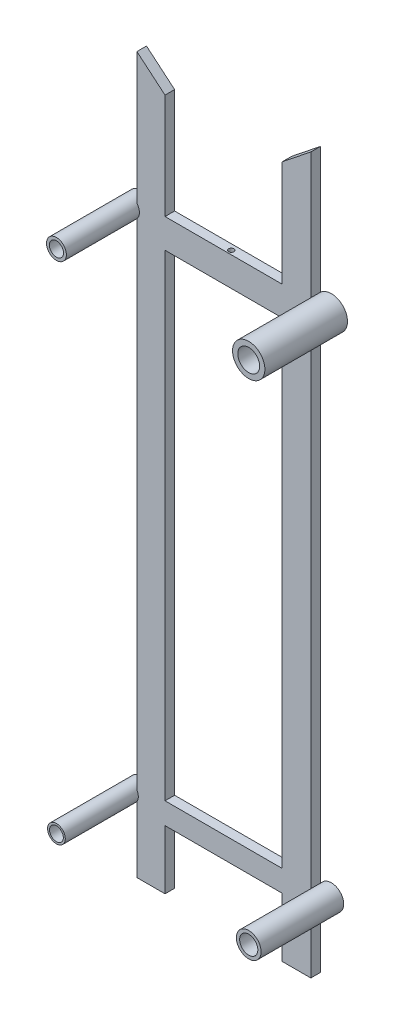
ISO-10303-21;
HEADER;
FILE_DESCRIPTION(('STEP AP214'),'2;1');
FILE_NAME('part.step','',(''),(''),'','','');
FILE_SCHEMA(('AUTOMOTIVE_DESIGN { 1 0 10303 214 1 1 1 1 }'));
ENDSEC;
DATA;
#1=APPLICATION_CONTEXT('core data for automotive mechanical design processes');
#2=APPLICATION_PROTOCOL_DEFINITION('international standard','automotive_design',2000,#1);
#3=PRODUCT_CONTEXT('',#1,'mechanical');
#4=PRODUCT('Part','Part','',(#3));
#5=PRODUCT_RELATED_PRODUCT_CATEGORY('part','',(#4));
#6=PRODUCT_DEFINITION_FORMATION('','',#4);
#7=PRODUCT_DEFINITION_CONTEXT('part definition',#1,'design');
#8=PRODUCT_DEFINITION('design','',#6,#7);
#9=PRODUCT_DEFINITION_SHAPE('','',#8);
#10=(LENGTH_UNIT() NAMED_UNIT(*) SI_UNIT(.MILLI.,.METRE.));
#11=(NAMED_UNIT(*) PLANE_ANGLE_UNIT() SI_UNIT($,.RADIAN.));
#12=(NAMED_UNIT(*) SI_UNIT($,.STERADIAN.) SOLID_ANGLE_UNIT());
#13=UNCERTAINTY_MEASURE_WITH_UNIT(LENGTH_MEASURE(1.E-05),#10,'distance_accuracy_value','');
#14=(GEOMETRIC_REPRESENTATION_CONTEXT(3) GLOBAL_UNCERTAINTY_ASSIGNED_CONTEXT((#13)) GLOBAL_UNIT_ASSIGNED_CONTEXT((#10,
#11,#12)) REPRESENTATION_CONTEXT('',''));
#15=CARTESIAN_POINT('',(0.,0.,0.));
#16=DIRECTION('',(0.,0.,1.));
#17=DIRECTION('',(1.,0.,0.));
#18=AXIS2_PLACEMENT_3D('',#15,#16,#17);
#19=CARTESIAN_POINT('',(518.159541103016,0.,1061.01410856187));
#20=DIRECTION('',(-1.,0.,0.));
#21=DIRECTION('',(0.,0.,1.));
#22=AXIS2_PLACEMENT_3D('',#19,#20,#21);
#23=PLANE('',#22);
#24=DIRECTION('',(0.,1.,0.));
#25=VECTOR('',#24,1.);
#26=CARTESIAN_POINT('',(518.159541103016,0.,1027.01410856187));
#27=LINE('',#26,#25);
#28=CARTESIAN_POINT('',(518.159541103016,-2095.79960840738,1027.01410856187));
#29=VERTEX_POINT('',#28);
#30=CARTESIAN_POINT('',(518.159541103016,-340.576498178307,1027.01410856187));
#31=VERTEX_POINT('',#30);
#32=EDGE_CURVE('E106',#29,#31,#27,.T.);
#33=ORIENTED_EDGE('',*,*,#32,.F.);
#34=DIRECTION('',(0.,0.,-1.));
#35=VECTOR('',#34,1.);
#36=CARTESIAN_POINT('',(518.159541103016,-2095.79960840738,1320.01410856187));
#37=LINE('',#36,#35);
#38=CARTESIAN_POINT('',(518.159541103016,-2095.79960840738,1061.01410856187));
#39=VERTEX_POINT('',#38);
#40=EDGE_CURVE('E489',#29,#39,#37,.F.);
#41=ORIENTED_EDGE('',*,*,#40,.T.);
#42=DIRECTION('',(0.,1.,0.));
#43=VECTOR('',#42,1.);
#44=CARTESIAN_POINT('',(518.159541103016,0.,1061.01410856187));
#45=LINE('',#44,#43);
#46=CARTESIAN_POINT('',(518.159541103016,-340.576498178307,1061.01410856187));
#47=VERTEX_POINT('',#46);
#48=EDGE_CURVE('E346',#39,#47,#45,.T.);
#49=ORIENTED_EDGE('',*,*,#48,.T.);
#50=DIRECTION('',(0.,0.,-1.));
#51=VECTOR('',#50,1.);
#52=CARTESIAN_POINT('',(518.159541103016,-340.576498178307,1320.01410856187));
#53=LINE('',#52,#51);
#54=EDGE_CURVE('E342',#47,#31,#53,.T.);
#55=ORIENTED_EDGE('',*,*,#54,.T.);
#56=EDGE_LOOP('',(#33,#41,#49,#55));
#57=FACE_BOUND('',#56,.T.);
#58=ADVANCED_FACE('F91',(#57),#23,.T.);
#59=CARTESIAN_POINT('',(518.159541103016,-2363.99744422089,1061.01410856187));
#60=VERTEX_POINT('',#59);
#61=CARTESIAN_POINT('',(518.159541103016,-2129.9220900624,1061.01410856187));
#62=VERTEX_POINT('',#61);
#63=EDGE_CURVE('E355',#60,#62,#45,.T.);
#64=ORIENTED_EDGE('',*,*,#63,.T.);
#65=DIRECTION('',(0.,0.,-1.));
#66=VECTOR('',#65,1.);
#67=CARTESIAN_POINT('',(518.159541103016,-2129.9220900624,1320.01410856187));
#68=LINE('',#67,#66);
#69=CARTESIAN_POINT('',(518.159541103016,-2129.9220900624,1027.01410856187));
#70=VERTEX_POINT('',#69);
#71=EDGE_CURVE('E114',#62,#70,#68,.T.);
#72=ORIENTED_EDGE('',*,*,#71,.T.);
#73=CARTESIAN_POINT('',(518.159541103016,-2363.99744422089,1027.01410856187));
#74=VERTEX_POINT('',#73);
#75=EDGE_CURVE('E418',#74,#70,#27,.T.);
#76=ORIENTED_EDGE('',*,*,#75,.F.);
#77=DIRECTION('',(0.,0.,-1.));
#78=VECTOR('',#77,1.);
#79=CARTESIAN_POINT('',(518.159541103016,-2363.99744422089,1061.01410856187));
#80=LINE('',#79,#78);
#81=EDGE_CURVE('E317',#60,#74,#80,.T.);
#82=ORIENTED_EDGE('',*,*,#81,.F.);
#83=EDGE_LOOP('',(#64,#72,#76,#82));
#84=FACE_BOUND('',#83,.T.);
#85=ADVANCED_FACE('F484',(#84),#23,.T.);
#86=CARTESIAN_POINT('',(518.159541103016,-293.826728607705,1027.01410856187));
#87=VERTEX_POINT('',#86);
#88=CARTESIAN_POINT('',(518.159541103016,172.765208514383,1027.01410856187));
#89=VERTEX_POINT('',#88);
#90=EDGE_CURVE('E357',#87,#89,#27,.T.);
#91=ORIENTED_EDGE('',*,*,#90,.F.);
#92=DIRECTION('',(0.,0.,-1.));
#93=VECTOR('',#92,1.);
#94=CARTESIAN_POINT('',(518.159541103016,-293.826728607705,1320.01410856187));
#95=LINE('',#94,#93);
#96=CARTESIAN_POINT('',(518.159541103016,-293.826728607705,1061.01410856187));
#97=VERTEX_POINT('',#96);
#98=EDGE_CURVE('E340',#87,#97,#95,.F.);
#99=ORIENTED_EDGE('',*,*,#98,.T.);
#100=CARTESIAN_POINT('',(518.159541103016,172.765208514383,1061.01410856187));
#101=VERTEX_POINT('',#100);
#102=EDGE_CURVE('E348',#97,#101,#45,.T.);
#103=ORIENTED_EDGE('',*,*,#102,.T.);
#104=DIRECTION('',(0.,0.,-1.));
#105=VECTOR('',#104,1.);
#106=CARTESIAN_POINT('',(518.159541103016,172.765208514383,1061.01410856187));
#107=LINE('',#106,#105);
#108=EDGE_CURVE('E300',#101,#89,#107,.T.);
#109=ORIENTED_EDGE('',*,*,#108,.T.);
#110=EDGE_LOOP('',(#91,#99,#103,#109));
#111=FACE_BOUND('',#110,.T.);
#112=ADVANCED_FACE('F356',(#111),#23,.T.);
#113=CARTESIAN_POINT('',(1173.63922552686,-317.201613393006,1320.01410856187));
#114=DIRECTION('',(0.,0.,-1.));
#115=DIRECTION('',(-1.,0.,0.));
#116=AXIS2_PLACEMENT_3D('',#113,#114,#115);
#117=CYLINDRICAL_SURFACE('',#116,57.2810174636805);
#118=CARTESIAN_POINT('',(1173.63922552686,-317.201613393006,1320.01410856187));
#119=DIRECTION('',(0.,0.,1.));
#120=DIRECTION('',(1.,0.,0.));
#121=AXIS2_PLACEMENT_3D('',#118,#119,#120);
#122=CIRCLE('',#121,57.2810174636805);
#123=CARTESIAN_POINT('',(1230.92024299054,-317.201613393006,1320.01410856187));
#124=VERTEX_POINT('',#123);
#125=EDGE_CURVE('E328',#124,#124,#122,.T.);
#126=ORIENTED_EDGE('',*,*,#125,.F.);
#127=EDGE_LOOP('',(#126));
#128=FACE_BOUND('',#127,.T.);
#129=DIRECTION('',(0.,0.,-1.));
#130=VECTOR('',#129,1.);
#131=CARTESIAN_POINT('',(1134.86751024174,-275.036828850402,1320.01410856187));
#132=LINE('',#131,#130);
#133=CARTESIAN_POINT('',(1134.86751024174,-275.036828850402,1061.01410856187));
#134=VERTEX_POINT('',#133);
#135=CARTESIAN_POINT('',(1134.86751024174,-275.036828850402,1027.01410856187));
#136=VERTEX_POINT('',#135);
#137=EDGE_CURVE('E319',#134,#136,#132,.T.);
#138=ORIENTED_EDGE('',*,*,#137,.F.);
#139=CARTESIAN_POINT('',(1173.63922552686,-317.201613393006,1061.01410856187));
#140=DIRECTION('',(0.,0.,-1.));
#141=DIRECTION('',(-1.,0.,0.));
#142=AXIS2_PLACEMENT_3D('',#139,#140,#141);
#143=CIRCLE('',#142,57.2810174636805);
#144=CARTESIAN_POINT('',(1134.86751024174,-359.36639793561,1061.01410856187));
#145=VERTEX_POINT('',#144);
#146=EDGE_CURVE('E313',#145,#134,#143,.T.);
#147=ORIENTED_EDGE('',*,*,#146,.F.);
#148=DIRECTION('',(0.,0.,-1.));
#149=VECTOR('',#148,1.);
#150=CARTESIAN_POINT('',(1134.86751024174,-359.36639793561,1320.01410856187));
#151=LINE('',#150,#149);
#152=CARTESIAN_POINT('',(1134.86751024174,-359.36639793561,1027.01410856187));
#153=VERTEX_POINT('',#152);
#154=EDGE_CURVE('E316',#153,#145,#151,.F.);
#155=ORIENTED_EDGE('',*,*,#154,.F.);
#156=CARTESIAN_POINT('',(1173.63922552686,-317.201613393006,1027.01410856187));
#157=DIRECTION('',(0.,0.,1.));
#158=DIRECTION('',(1.,0.,0.));
#159=AXIS2_PLACEMENT_3D('',#156,#157,#158);
#160=CIRCLE('',#159,57.2810174636805);
#161=EDGE_CURVE('E274',#153,#136,#160,.T.);
#162=ORIENTED_EDGE('',*,*,#161,.T.);
#163=EDGE_LOOP('',(#138,#147,#155,#162));
#164=FACE_BOUND('',#163,.T.);
#165=ADVANCED_FACE('F93',(#128,#164),#117,.T.);
#166=CARTESIAN_POINT('',(1173.63922552686,-317.201613393006,1320.01410856187));
#167=DIRECTION('',(0.,0.,1.));
#168=DIRECTION('',(1.,0.,0.));
#169=AXIS2_PLACEMENT_3D('',#166,#167,#168);
#170=PLANE('',#169);
#171=ORIENTED_EDGE('',*,*,#125,.T.);
#172=EDGE_LOOP('',(#171));
#173=FACE_BOUND('',#172,.T.);
#174=CARTESIAN_POINT('',(1173.63922552686,-317.201613393006,1320.01410856187));
#175=DIRECTION('',(0.,0.,1.));
#176=DIRECTION('',(1.,0.,0.));
#177=AXIS2_PLACEMENT_3D('',#174,#175,#176);
#178=CIRCLE('',#177,38.7717152851179);
#179=CARTESIAN_POINT('',(1212.41094081198,-317.201613393006,1320.01410856187));
#180=VERTEX_POINT('',#179);
#181=EDGE_CURVE('E323',#180,#180,#178,.T.);
#182=ORIENTED_EDGE('',*,*,#181,.F.);
#183=EDGE_LOOP('',(#182));
#184=FACE_BOUND('',#183,.T.);
#185=ADVANCED_FACE('F517',(#173,#184),#170,.T.);
#186=CARTESIAN_POINT('',(1173.63922552686,-317.201613393006,1027.01410856187));
#187=DIRECTION('',(0.,0.,1.));
#188=DIRECTION('',(1.,0.,0.));
#189=AXIS2_PLACEMENT_3D('',#186,#187,#188);
#190=PLANE('',#189);
#191=ORIENTED_EDGE('',*,*,#75,.T.);
#192=CARTESIAN_POINT('',(491.765116757733,-2112.86084923489,1027.01410856187));
#193=DIRECTION('',(0.,0.,1.));
#194=DIRECTION('',(1.,0.,0.));
#195=AXIS2_PLACEMENT_3D('',#192,#193,#194);
#196=CIRCLE('',#195,31.4285153179899);
#197=EDGE_CURVE('E490',#29,#70,#196,.T.);
#198=ORIENTED_EDGE('',*,*,#197,.F.);
#199=ORIENTED_EDGE('',*,*,#32,.T.);
#200=CARTESIAN_POINT('',(491.765116757733,-317.201613393006,1027.01410856187));
#201=DIRECTION('',(0.,0.,1.));
#202=DIRECTION('',(1.,0.,0.));
#203=AXIS2_PLACEMENT_3D('',#200,#201,#202);
#204=CIRCLE('',#203,35.256926627898);
#205=EDGE_CURVE('E502',#87,#31,#204,.T.);
#206=ORIENTED_EDGE('',*,*,#205,.F.);
#207=ORIENTED_EDGE('',*,*,#90,.T.);
#208=DIRECTION('',(0.765360515626495,-0.643601803229253,0.));
#209=VECTOR('',#208,1.);
#210=CARTESIAN_POINT('',(299.735711510121,356.440702251024,1027.01410856187));
#211=LINE('',#210,#209);
#212=CARTESIAN_POINT('',(617.883714932091,88.9058287952673,1027.01410856187));
#213=VERTEX_POINT('',#212);
#214=EDGE_CURVE('E420',#89,#213,#211,.T.);
#215=ORIENTED_EDGE('',*,*,#214,.T.);
#216=DIRECTION('',(0.,1.,0.));
#217=VECTOR('',#216,1.);
#218=CARTESIAN_POINT('',(617.883714932091,0.,1027.01410856187));
#219=LINE('',#218,#217);
#220=CARTESIAN_POINT('',(617.883714932091,-284.095196719198,1027.01410856187));
#221=VERTEX_POINT('',#220);
#222=EDGE_CURVE('E423',#221,#213,#219,.T.);
#223=ORIENTED_EDGE('',*,*,#222,.F.);
#224=DIRECTION('',(-1.,0.,0.));
#225=VECTOR('',#224,1.);
#226=CARTESIAN_POINT('',(0.,-284.095196719198,1027.01410856187));
#227=LINE('',#226,#225);
#228=CARTESIAN_POINT('',(1033.16669392661,-284.095196719198,1027.01410856187));
#229=VERTEX_POINT('',#228);
#230=EDGE_CURVE('E426',#229,#221,#227,.T.);
#231=ORIENTED_EDGE('',*,*,#230,.F.);
#232=DIRECTION('',(0.,1.,0.));
#233=VECTOR('',#232,1.);
#234=CARTESIAN_POINT('',(1033.16669392661,0.,1027.01410856187));
#235=LINE('',#234,#233);
#236=CARTESIAN_POINT('',(1033.16669392661,91.6171502164165,1027.01410856187));
#237=VERTEX_POINT('',#236);
#238=EDGE_CURVE('E429',#229,#237,#235,.T.);
#239=ORIENTED_EDGE('',*,*,#238,.T.);
#240=DIRECTION('',(-0.781665241211568,-0.623698204808754,0.));
#241=VECTOR('',#240,1.);
#242=CARTESIAN_POINT('',(357.235789445738,-447.714611607919,1027.01410856187));
#243=LINE('',#242,#241);
#244=CARTESIAN_POINT('',(1134.86751024174,172.765208514383,1027.01410856187));
#245=VERTEX_POINT('',#244);
#246=EDGE_CURVE('E432',#245,#237,#243,.T.);
#247=ORIENTED_EDGE('',*,*,#246,.F.);
#248=DIRECTION('',(0.,1.,0.));
#249=VECTOR('',#248,1.);
#250=CARTESIAN_POINT('',(1134.86751024174,0.,1027.01410856187));
#251=LINE('',#250,#249);
#252=EDGE_CURVE('E278',#136,#245,#251,.T.);
#253=ORIENTED_EDGE('',*,*,#252,.F.);
#254=ORIENTED_EDGE('',*,*,#161,.F.);
#255=CARTESIAN_POINT('',(1134.86751024174,-2092.49193717116,1027.01410856187));
#256=VERTEX_POINT('',#255);
#257=EDGE_CURVE('E270',#256,#153,#251,.T.);
#258=ORIENTED_EDGE('',*,*,#257,.F.);
#259=CARTESIAN_POINT('',(1173.63922552686,-2112.86084923489,1027.01410856187));
#260=DIRECTION('',(0.,0.,1.));
#261=DIRECTION('',(1.,0.,0.));
#262=AXIS2_PLACEMENT_3D('',#259,#260,#261);
#263=CIRCLE('',#262,43.7965579105265);
#264=CARTESIAN_POINT('',(1134.86751024174,-2133.22976129862,1027.01410856187));
#265=VERTEX_POINT('',#264);
#266=EDGE_CURVE('E254',#265,#256,#263,.T.);
#267=ORIENTED_EDGE('',*,*,#266,.F.);
#268=DIRECTION('',(0.,1.,0.));
#269=VECTOR('',#268,1.);
#270=CARTESIAN_POINT('',(1134.86751024174,0.,1027.01410856187));
#271=LINE('',#270,#269);
#272=CARTESIAN_POINT('',(1134.86751024174,-2363.99744422089,1027.01410856187));
#273=VERTEX_POINT('',#272);
#274=EDGE_CURVE('E277',#273,#265,#271,.T.);
#275=ORIENTED_EDGE('',*,*,#274,.F.);
#276=DIRECTION('',(-1.,0.,0.));
#277=VECTOR('',#276,1.);
#278=CARTESIAN_POINT('',(0.,-2363.99744422089,1027.01410856187));
#279=LINE('',#278,#277);
#280=CARTESIAN_POINT('',(1033.16669392661,-2363.99744422089,1027.01410856187));
#281=VERTEX_POINT('',#280);
#282=EDGE_CURVE('E436',#273,#281,#279,.T.);
#283=ORIENTED_EDGE('',*,*,#282,.T.);
#284=DIRECTION('',(0.,1.,0.));
#285=VECTOR('',#284,1.);
#286=CARTESIAN_POINT('',(1033.16669392661,0.,1027.01410856187));
#287=LINE('',#286,#285);
#288=CARTESIAN_POINT('',(1033.16669392661,-2154.50626286869,1027.01410856187));
#289=VERTEX_POINT('',#288);
#290=EDGE_CURVE('E439',#281,#289,#287,.T.);
#291=ORIENTED_EDGE('',*,*,#290,.T.);
#292=DIRECTION('',(-1.,0.,0.));
#293=VECTOR('',#292,1.);
#294=CARTESIAN_POINT('',(0.,-2154.50626286869,1027.01410856187));
#295=LINE('',#294,#293);
#296=CARTESIAN_POINT('',(617.883714932091,-2154.50626286869,1027.01410856187));
#297=VERTEX_POINT('',#296);
#298=EDGE_CURVE('E442',#289,#297,#295,.T.);
#299=ORIENTED_EDGE('',*,*,#298,.T.);
#300=DIRECTION('',(0.,1.,0.));
#301=VECTOR('',#300,1.);
#302=CARTESIAN_POINT('',(617.883714932091,0.,1027.01410856187));
#303=LINE('',#302,#301);
#304=CARTESIAN_POINT('',(617.883714932091,-2363.99744422089,1027.01410856187));
#305=VERTEX_POINT('',#304);
#306=EDGE_CURVE('E445',#305,#297,#303,.T.);
#307=ORIENTED_EDGE('',*,*,#306,.F.);
#308=DIRECTION('',(1.,0.,0.));
#309=VECTOR('',#308,1.);
#310=CARTESIAN_POINT('',(0.,-2363.99744422089,1027.01410856187));
#311=LINE('',#310,#309);
#312=EDGE_CURVE('E371',#74,#305,#311,.T.);
#313=ORIENTED_EDGE('',*,*,#312,.F.);
#314=EDGE_LOOP('',(#191,#198,#199,#206,#207,#215,#223,#231,#239,#247,#253,#254,#258,#267,#275,
#283,#291,#299,#307,#313));
#315=FACE_BOUND('',#314,.T.);
#316=CARTESIAN_POINT('',(1173.63922552686,-317.201613393006,1027.01410856187));
#317=DIRECTION('',(0.,0.,1.));
#318=DIRECTION('',(1.,0.,0.));
#319=AXIS2_PLACEMENT_3D('',#316,#317,#318);
#320=CIRCLE('',#319,38.7717152851179);
#321=CARTESIAN_POINT('',(1212.41094081198,-317.201613393006,1027.01410856187));
#322=VERTEX_POINT('',#321);
#323=EDGE_CURVE('E322',#322,#322,#320,.T.);
#324=ORIENTED_EDGE('',*,*,#323,.T.);
#325=EDGE_LOOP('',(#324));
#326=FACE_BOUND('',#325,.T.);
#327=DIRECTION('',(0.,1.,0.));
#328=VECTOR('',#327,1.);
#329=CARTESIAN_POINT('',(1033.16669392661,0.,1027.01410856187));
#330=LINE('',#329,#328);
#331=CARTESIAN_POINT('',(1033.16669392661,-2078.31095892184,1027.01410856187));
#332=VERTEX_POINT('',#331);
#333=CARTESIAN_POINT('',(1033.16669392661,-387.582459759298,1027.01410856187));
#334=VERTEX_POINT('',#333);
#335=EDGE_CURVE('E361',#332,#334,#330,.T.);
#336=ORIENTED_EDGE('',*,*,#335,.T.);
#337=DIRECTION('',(-1.,0.,0.));
#338=VECTOR('',#337,1.);
#339=CARTESIAN_POINT('',(0.,-387.582459759298,1027.01410856187));
#340=LINE('',#339,#338);
#341=CARTESIAN_POINT('',(617.883714932091,-387.582459759298,1027.01410856187));
#342=VERTEX_POINT('',#341);
#343=EDGE_CURVE('E412',#334,#342,#340,.T.);
#344=ORIENTED_EDGE('',*,*,#343,.T.);
#345=DIRECTION('',(0.,1.,0.));
#346=VECTOR('',#345,1.);
#347=CARTESIAN_POINT('',(617.883714932091,0.,1027.01410856187));
#348=LINE('',#347,#346);
#349=CARTESIAN_POINT('',(617.883714932091,-2078.31095892184,1027.01410856187));
#350=VERTEX_POINT('',#349);
#351=EDGE_CURVE('E415',#350,#342,#348,.T.);
#352=ORIENTED_EDGE('',*,*,#351,.F.);
#353=DIRECTION('',(-1.,0.,0.));
#354=VECTOR('',#353,1.);
#355=CARTESIAN_POINT('',(0.,-2078.31095892184,1027.01410856187));
#356=LINE('',#355,#354);
#357=EDGE_CURVE('E358',#332,#350,#356,.T.);
#358=ORIENTED_EDGE('',*,*,#357,.F.);
#359=EDGE_LOOP('',(#336,#344,#352,#358));
#360=FACE_BOUND('',#359,.T.);
#361=CARTESIAN_POINT('',(491.765116757733,-317.201613393006,1027.01410856187));
#362=DIRECTION('',(0.,0.,1.));
#363=DIRECTION('',(1.,0.,0.));
#364=AXIS2_PLACEMENT_3D('',#361,#362,#363);
#365=CIRCLE('',#364,25.1474237483476);
#366=CARTESIAN_POINT('',(516.91254050608,-317.201613393006,1027.01410856187));
#367=VERTEX_POINT('',#366);
#368=EDGE_CURVE('E493',#367,#367,#365,.T.);
#369=ORIENTED_EDGE('',*,*,#368,.T.);
#370=EDGE_LOOP('',(#369));
#371=FACE_BOUND('',#370,.T.);
#372=CARTESIAN_POINT('',(491.765116757733,-2112.86084923489,1027.01410856187));
#373=DIRECTION('',(0.,0.,1.));
#374=DIRECTION('',(1.,0.,0.));
#375=AXIS2_PLACEMENT_3D('',#372,#373,#374);
#376=CIRCLE('',#375,24.5210757220368);
#377=CARTESIAN_POINT('',(516.28619247977,-2112.86084923489,1027.01410856187));
#378=VERTEX_POINT('',#377);
#379=EDGE_CURVE('E836',#378,#378,#376,.T.);
#380=ORIENTED_EDGE('',*,*,#379,.T.);
#381=EDGE_LOOP('',(#380));
#382=FACE_BOUND('',#381,.T.);
#383=CARTESIAN_POINT('',(1173.63922552686,-2112.86084923489,1027.01410856187));
#384=DIRECTION('',(0.,0.,1.));
#385=DIRECTION('',(1.,0.,0.));
#386=AXIS2_PLACEMENT_3D('',#383,#384,#385);
#387=CIRCLE('',#386,32.2544928425061);
#388=CARTESIAN_POINT('',(1205.89371836936,-2112.86084923489,1027.01410856187));
#389=VERTEX_POINT('',#388);
#390=EDGE_CURVE('E828',#389,#389,#387,.T.);
#391=ORIENTED_EDGE('',*,*,#390,.T.);
#392=EDGE_LOOP('',(#391));
#393=FACE_BOUND('',#392,.T.);
#394=ADVANCED_FACE('F271',(#315,#326,#360,#371,#382,#393),#190,.F.);
#395=CARTESIAN_POINT('',(1173.63922552686,-317.201613393006,1320.01410856187));
#396=DIRECTION('',(0.,0.,-1.));
#397=DIRECTION('',(-1.,0.,0.));
#398=AXIS2_PLACEMENT_3D('',#395,#396,#397);
#399=CYLINDRICAL_SURFACE('',#398,38.7717152851179);
#400=ORIENTED_EDGE('',*,*,#323,.F.);
#401=EDGE_LOOP('',(#400));
#402=FACE_BOUND('',#401,.T.);
#403=ORIENTED_EDGE('',*,*,#181,.T.);
#404=EDGE_LOOP('',(#403));
#405=FACE_BOUND('',#404,.T.);
#406=ADVANCED_FACE('F581',(#402,#405),#399,.F.);
#407=CARTESIAN_POINT('',(1134.86751024174,0.,1061.01410856187));
#408=DIRECTION('',(-1.,0.,0.));
#409=DIRECTION('',(0.,0.,1.));
#410=AXIS2_PLACEMENT_3D('',#407,#408,#409);
#411=PLANE('',#410);
#412=DIRECTION('',(0.,1.,0.));
#413=VECTOR('',#412,1.);
#414=CARTESIAN_POINT('',(1134.86751024174,0.,1061.01410856187));
#415=LINE('',#414,#413);
#416=CARTESIAN_POINT('',(1134.86751024174,172.765208514383,1061.01410856187));
#417=VERTEX_POINT('',#416);
#418=EDGE_CURVE('E390',#134,#417,#415,.T.);
#419=ORIENTED_EDGE('',*,*,#418,.F.);
#420=ORIENTED_EDGE('',*,*,#137,.T.);
#421=ORIENTED_EDGE('',*,*,#252,.T.);
#422=DIRECTION('',(0.,0.,-1.));
#423=VECTOR('',#422,1.);
#424=CARTESIAN_POINT('',(1134.86751024174,172.765208514383,1061.01410856187));
#425=LINE('',#424,#423);
#426=EDGE_CURVE('E284',#417,#245,#425,.T.);
#427=ORIENTED_EDGE('',*,*,#426,.F.);
#428=EDGE_LOOP('',(#419,#420,#421,#427));
#429=FACE_BOUND('',#428,.T.);
#430=ADVANCED_FACE('F530',(#429),#411,.F.);
#431=ORIENTED_EDGE('',*,*,#257,.T.);
#432=ORIENTED_EDGE('',*,*,#154,.T.);
#433=CARTESIAN_POINT('',(1134.86751024174,-2092.49193717116,1061.01410856187));
#434=VERTEX_POINT('',#433);
#435=EDGE_CURVE('E282',#434,#145,#415,.T.);
#436=ORIENTED_EDGE('',*,*,#435,.F.);
#437=DIRECTION('',(0.,0.,-1.));
#438=VECTOR('',#437,1.);
#439=CARTESIAN_POINT('',(1134.86751024174,-2092.49193717116,1061.01410856187));
#440=LINE('',#439,#438);
#441=EDGE_CURVE('E258',#434,#256,#440,.T.);
#442=ORIENTED_EDGE('',*,*,#441,.T.);
#443=EDGE_LOOP('',(#431,#432,#436,#442));
#444=FACE_BOUND('',#443,.T.);
#445=ADVANCED_FACE('F280',(#444),#411,.F.);
#446=CARTESIAN_POINT('',(0.,-387.582459759298,1061.01410856187));
#447=DIRECTION('',(0.,-1.,0.));
#448=DIRECTION('',(0.,0.,-1.));
#449=AXIS2_PLACEMENT_3D('',#446,#447,#448);
#450=PLANE('',#449);
#451=CARTESIAN_POINT('',(838.898443773794,-387.582459759298,1047.15515701302));
#452=DIRECTION('',(0.,-1.,0.));
#453=DIRECTION('',(0.,0.,-1.));
#454=AXIS2_PLACEMENT_3D('',#451,#452,#453);
#455=CIRCLE('',#454,9.31366205789842);
#456=CARTESIAN_POINT('',(838.898443773794,-387.582459759298,1037.84149495512));
#457=VERTEX_POINT('',#456);
#458=EDGE_CURVE('E823',#457,#457,#455,.T.);
#459=ORIENTED_EDGE('',*,*,#458,.F.);
#460=EDGE_LOOP('',(#459));
#461=FACE_BOUND('',#460,.T.);
#462=ORIENTED_EDGE('',*,*,#343,.F.);
#463=DIRECTION('',(0.,0.,-1.));
#464=VECTOR('',#463,1.);
#465=CARTESIAN_POINT('',(1033.16669392661,-387.582459759298,1061.01410856187));
#466=LINE('',#465,#464);
#467=CARTESIAN_POINT('',(1033.16669392661,-387.582459759298,1061.01410856187));
#468=VERTEX_POINT('',#467);
#469=EDGE_CURVE('E308',#468,#334,#466,.T.);
#470=ORIENTED_EDGE('',*,*,#469,.F.);
#471=DIRECTION('',(-1.,0.,0.));
#472=VECTOR('',#471,1.);
#473=CARTESIAN_POINT('',(0.,-387.582459759298,1061.01410856187));
#474=LINE('',#473,#472);
#475=CARTESIAN_POINT('',(617.883714932091,-387.582459759298,1061.01410856187));
#476=VERTEX_POINT('',#475);
#477=EDGE_CURVE('E374',#468,#476,#474,.T.);
#478=ORIENTED_EDGE('',*,*,#477,.T.);
#479=DIRECTION('',(0.,0.,-1.));
#480=VECTOR('',#479,1.);
#481=CARTESIAN_POINT('',(617.883714932091,-387.582459759298,1061.01410856187));
#482=LINE('',#481,#480);
#483=EDGE_CURVE('E306',#476,#342,#482,.T.);
#484=ORIENTED_EDGE('',*,*,#483,.T.);
#485=EDGE_LOOP('',(#462,#470,#478,#484));
#486=FACE_BOUND('',#485,.T.);
#487=ADVANCED_FACE('F552',(#461,#486),#450,.T.);
#488=CARTESIAN_POINT('',(0.,-284.095196719198,1061.01410856187));
#489=DIRECTION('',(0.,-1.,0.));
#490=DIRECTION('',(0.,0.,-1.));
#491=AXIS2_PLACEMENT_3D('',#488,#489,#490);
#492=PLANE('',#491);
#493=CARTESIAN_POINT('',(838.898443773794,-284.095196719198,1047.15515701302));
#494=DIRECTION('',(0.,1.,0.));
#495=DIRECTION('',(0.,0.,1.));
#496=AXIS2_PLACEMENT_3D('',#493,#494,#495);
#497=CIRCLE('',#496,9.31366205789842);
#498=CARTESIAN_POINT('',(838.898443773794,-284.095196719198,1056.46881907091));
#499=VERTEX_POINT('',#498);
#500=EDGE_CURVE('E826',#499,#499,#497,.T.);
#501=ORIENTED_EDGE('',*,*,#500,.F.);
#502=EDGE_LOOP('',(#501));
#503=FACE_BOUND('',#502,.T.);
#504=ORIENTED_EDGE('',*,*,#230,.T.);
#505=DIRECTION('',(0.,0.,-1.));
#506=VECTOR('',#505,1.);
#507=CARTESIAN_POINT('',(617.883714932091,-284.095196719198,1061.01410856187));
#508=LINE('',#507,#506);
#509=CARTESIAN_POINT('',(617.883714932091,-284.095196719198,1061.01410856187));
#510=VERTEX_POINT('',#509);
#511=EDGE_CURVE('E296',#510,#221,#508,.T.);
#512=ORIENTED_EDGE('',*,*,#511,.F.);
#513=DIRECTION('',(-1.,0.,0.));
#514=VECTOR('',#513,1.);
#515=CARTESIAN_POINT('',(0.,-284.095196719198,1061.01410856187));
#516=LINE('',#515,#514);
#517=CARTESIAN_POINT('',(1033.16669392661,-284.095196719198,1061.01410856187));
#518=VERTEX_POINT('',#517);
#519=EDGE_CURVE('E382',#518,#510,#516,.T.);
#520=ORIENTED_EDGE('',*,*,#519,.F.);
#521=DIRECTION('',(0.,0.,-1.));
#522=VECTOR('',#521,1.);
#523=CARTESIAN_POINT('',(1033.16669392661,-284.095196719198,1061.01410856187));
#524=LINE('',#523,#522);
#525=EDGE_CURVE('E294',#518,#229,#524,.T.);
#526=ORIENTED_EDGE('',*,*,#525,.T.);
#527=EDGE_LOOP('',(#504,#512,#520,#526));
#528=FACE_BOUND('',#527,.T.);
#529=ADVANCED_FACE('F542',(#503,#528),#492,.F.);
#530=CARTESIAN_POINT('',(1033.16669392661,0.,1061.01410856187));
#531=DIRECTION('',(-1.,0.,0.));
#532=DIRECTION('',(0.,-1.,0.));
#533=AXIS2_PLACEMENT_3D('',#530,#531,#532);
#534=PLANE('',#533);
#535=ORIENTED_EDGE('',*,*,#335,.F.);
#536=DIRECTION('',(0.,0.,-1.));
#537=VECTOR('',#536,1.);
#538=CARTESIAN_POINT('',(1033.16669392661,-2078.31095892184,1061.01410856187));
#539=LINE('',#538,#537);
#540=CARTESIAN_POINT('',(1033.16669392661,-2078.31095892184,1061.01410856187));
#541=VERTEX_POINT('',#540);
#542=EDGE_CURVE('E310',#541,#332,#539,.T.);
#543=ORIENTED_EDGE('',*,*,#542,.F.);
#544=DIRECTION('',(0.,1.,0.));
#545=VECTOR('',#544,1.);
#546=CARTESIAN_POINT('',(1033.16669392661,0.,1061.01410856187));
#547=LINE('',#546,#545);
#548=EDGE_CURVE('E370',#541,#468,#547,.T.);
#549=ORIENTED_EDGE('',*,*,#548,.T.);
#550=ORIENTED_EDGE('',*,*,#469,.T.);
#551=EDGE_LOOP('',(#535,#543,#549,#550));
#552=FACE_BOUND('',#551,.T.);
#553=ADVANCED_FACE('F566',(#552),#534,.T.);
#554=CARTESIAN_POINT('',(0.,-2078.31095892184,1061.01410856187));
#555=DIRECTION('',(0.,-1.,0.));
#556=DIRECTION('',(0.,0.,-1.));
#557=AXIS2_PLACEMENT_3D('',#554,#555,#556);
#558=PLANE('',#557);
#559=ORIENTED_EDGE('',*,*,#357,.T.);
#560=DIRECTION('',(0.,0.,-1.));
#561=VECTOR('',#560,1.);
#562=CARTESIAN_POINT('',(617.883714932091,-2078.31095892184,1061.01410856187));
#563=LINE('',#562,#561);
#564=CARTESIAN_POINT('',(617.883714932091,-2078.31095892184,1061.01410856187));
#565=VERTEX_POINT('',#564);
#566=EDGE_CURVE('E303',#565,#350,#563,.T.);
#567=ORIENTED_EDGE('',*,*,#566,.F.);
#568=DIRECTION('',(-1.,0.,0.));
#569=VECTOR('',#568,1.);
#570=CARTESIAN_POINT('',(0.,-2078.31095892184,1061.01410856187));
#571=LINE('',#570,#569);
#572=EDGE_CURVE('E367',#541,#565,#571,.T.);
#573=ORIENTED_EDGE('',*,*,#572,.F.);
#574=ORIENTED_EDGE('',*,*,#542,.T.);
#575=EDGE_LOOP('',(#559,#567,#573,#574));
#576=FACE_BOUND('',#575,.T.);
#577=ADVANCED_FACE('F576',(#576),#558,.F.);
#578=CARTESIAN_POINT('',(617.883714932091,0.,1061.01410856187));
#579=DIRECTION('',(-1.,0.,0.));
#580=DIRECTION('',(0.,0.,1.));
#581=AXIS2_PLACEMENT_3D('',#578,#579,#580);
#582=PLANE('',#581);
#583=ORIENTED_EDGE('',*,*,#351,.T.);
#584=ORIENTED_EDGE('',*,*,#483,.F.);
#585=DIRECTION('',(0.,1.,0.));
#586=VECTOR('',#585,1.);
#587=CARTESIAN_POINT('',(617.883714932091,0.,1061.01410856187));
#588=LINE('',#587,#586);
#589=EDGE_CURVE('E353',#565,#476,#588,.T.);
#590=ORIENTED_EDGE('',*,*,#589,.F.);
#591=ORIENTED_EDGE('',*,*,#566,.T.);
#592=EDGE_LOOP('',(#583,#584,#590,#591));
#593=FACE_BOUND('',#592,.T.);
#594=ADVANCED_FACE('F573',(#593),#582,.F.);
#595=CARTESIAN_POINT('',(0.,-2363.99744422089,1061.01410856187));
#596=DIRECTION('',(0.,1.,0.));
#597=DIRECTION('',(0.,0.,1.));
#598=AXIS2_PLACEMENT_3D('',#595,#596,#597);
#599=PLANE('',#598);
#600=ORIENTED_EDGE('',*,*,#312,.T.);
#601=DIRECTION('',(0.,0.,-1.));
#602=VECTOR('',#601,1.);
#603=CARTESIAN_POINT('',(617.883714932091,-2363.99744422089,1061.01410856187));
#604=LINE('',#603,#602);
#605=CARTESIAN_POINT('',(617.883714932091,-2363.99744422089,1061.01410856187));
#606=VERTEX_POINT('',#605);
#607=EDGE_CURVE('E451',#606,#305,#604,.T.);
#608=ORIENTED_EDGE('',*,*,#607,.F.);
#609=DIRECTION('',(1.,0.,0.));
#610=VECTOR('',#609,1.);
#611=CARTESIAN_POINT('',(0.,-2363.99744422089,1061.01410856187));
#612=LINE('',#611,#610);
#613=EDGE_CURVE('E312',#60,#606,#612,.T.);
#614=ORIENTED_EDGE('',*,*,#613,.F.);
#615=ORIENTED_EDGE('',*,*,#81,.T.);
#616=EDGE_LOOP('',(#600,#608,#614,#615));
#617=FACE_BOUND('',#616,.T.);
#618=ADVANCED_FACE('F481',(#617),#599,.F.);
#619=CARTESIAN_POINT('',(617.883714932091,0.,1061.01410856187));
#620=DIRECTION('',(-1.,0.,0.));
#621=DIRECTION('',(0.,0.,1.));
#622=AXIS2_PLACEMENT_3D('',#619,#620,#621);
#623=PLANE('',#622);
#624=ORIENTED_EDGE('',*,*,#306,.T.);
#625=DIRECTION('',(0.,0.,-1.));
#626=VECTOR('',#625,1.);
#627=CARTESIAN_POINT('',(617.883714932091,-2154.50626286869,1061.01410856187));
#628=LINE('',#627,#626);
#629=CARTESIAN_POINT('',(617.883714932091,-2154.50626286869,1061.01410856187));
#630=VERTEX_POINT('',#629);
#631=EDGE_CURVE('E454',#630,#297,#628,.T.);
#632=ORIENTED_EDGE('',*,*,#631,.F.);
#633=DIRECTION('',(0.,1.,0.));
#634=VECTOR('',#633,1.);
#635=CARTESIAN_POINT('',(617.883714932091,0.,1061.01410856187));
#636=LINE('',#635,#634);
#637=EDGE_CURVE('E406',#606,#630,#636,.T.);
#638=ORIENTED_EDGE('',*,*,#637,.F.);
#639=ORIENTED_EDGE('',*,*,#607,.T.);
#640=EDGE_LOOP('',(#624,#632,#638,#639));
#641=FACE_BOUND('',#640,.T.);
#642=ADVANCED_FACE('F477',(#641),#623,.F.);
#643=CARTESIAN_POINT('',(0.,-2154.50626286869,1061.01410856187));
#644=DIRECTION('',(0.,-1.,0.));
#645=DIRECTION('',(0.,0.,-1.));
#646=AXIS2_PLACEMENT_3D('',#643,#644,#645);
#647=PLANE('',#646);
#648=ORIENTED_EDGE('',*,*,#298,.F.);
#649=DIRECTION('',(0.,0.,-1.));
#650=VECTOR('',#649,1.);
#651=CARTESIAN_POINT('',(1033.16669392661,-2154.50626286869,1061.01410856187));
#652=LINE('',#651,#650);
#653=CARTESIAN_POINT('',(1033.16669392661,-2154.50626286869,1061.01410856187));
#654=VERTEX_POINT('',#653);
#655=EDGE_CURVE('E456',#654,#289,#652,.T.);
#656=ORIENTED_EDGE('',*,*,#655,.F.);
#657=DIRECTION('',(-1.,0.,0.));
#658=VECTOR('',#657,1.);
#659=CARTESIAN_POINT('',(0.,-2154.50626286869,1061.01410856187));
#660=LINE('',#659,#658);
#661=EDGE_CURVE('E403',#654,#630,#660,.T.);
#662=ORIENTED_EDGE('',*,*,#661,.T.);
#663=ORIENTED_EDGE('',*,*,#631,.T.);
#664=EDGE_LOOP('',(#648,#656,#662,#663));
#665=FACE_BOUND('',#664,.T.);
#666=ADVANCED_FACE('F473',(#665),#647,.T.);
#667=CARTESIAN_POINT('',(1033.16669392661,0.,1061.01410856187));
#668=DIRECTION('',(-1.,0.,0.));
#669=DIRECTION('',(0.,-1.,0.));
#670=AXIS2_PLACEMENT_3D('',#667,#668,#669);
#671=PLANE('',#670);
#672=ORIENTED_EDGE('',*,*,#290,.F.);
#673=DIRECTION('',(0.,0.,-1.));
#674=VECTOR('',#673,1.);
#675=CARTESIAN_POINT('',(1033.16669392661,-2363.99744422089,1061.01410856187));
#676=LINE('',#675,#674);
#677=CARTESIAN_POINT('',(1033.16669392661,-2363.99744422089,1061.01410856187));
#678=VERTEX_POINT('',#677);
#679=EDGE_CURVE('E458',#678,#281,#676,.T.);
#680=ORIENTED_EDGE('',*,*,#679,.F.);
#681=DIRECTION('',(0.,1.,0.));
#682=VECTOR('',#681,1.);
#683=CARTESIAN_POINT('',(1033.16669392661,0.,1061.01410856187));
#684=LINE('',#683,#682);
#685=EDGE_CURVE('E400',#678,#654,#684,.T.);
#686=ORIENTED_EDGE('',*,*,#685,.T.);
#687=ORIENTED_EDGE('',*,*,#655,.T.);
#688=EDGE_LOOP('',(#672,#680,#686,#687));
#689=FACE_BOUND('',#688,.T.);
#690=ADVANCED_FACE('F469',(#689),#671,.T.);
#691=CARTESIAN_POINT('',(0.,-2363.99744422089,1061.01410856187));
#692=DIRECTION('',(0.,-1.,0.));
#693=DIRECTION('',(0.,0.,-1.));
#694=AXIS2_PLACEMENT_3D('',#691,#692,#693);
#695=PLANE('',#694);
#696=ORIENTED_EDGE('',*,*,#282,.F.);
#697=DIRECTION('',(0.,0.,-1.));
#698=VECTOR('',#697,1.);
#699=CARTESIAN_POINT('',(1134.86751024174,-2363.99744422089,1061.01410856187));
#700=LINE('',#699,#698);
#701=CARTESIAN_POINT('',(1134.86751024174,-2363.99744422089,1061.01410856187));
#702=VERTEX_POINT('',#701);
#703=EDGE_CURVE('E286',#702,#273,#700,.T.);
#704=ORIENTED_EDGE('',*,*,#703,.F.);
#705=DIRECTION('',(-1.,0.,0.));
#706=VECTOR('',#705,1.);
#707=CARTESIAN_POINT('',(0.,-2363.99744422089,1061.01410856187));
#708=LINE('',#707,#706);
#709=EDGE_CURVE('E397',#702,#678,#708,.T.);
#710=ORIENTED_EDGE('',*,*,#709,.T.);
#711=ORIENTED_EDGE('',*,*,#679,.T.);
#712=EDGE_LOOP('',(#696,#704,#710,#711));
#713=FACE_BOUND('',#712,.T.);
#714=ADVANCED_FACE('F465',(#713),#695,.T.);
#715=CARTESIAN_POINT('',(1134.86751024174,0.,1061.01410856187));
#716=DIRECTION('',(-1.,0.,0.));
#717=DIRECTION('',(0.,0.,1.));
#718=AXIS2_PLACEMENT_3D('',#715,#716,#717);
#719=PLANE('',#718);
#720=ORIENTED_EDGE('',*,*,#274,.T.);
#721=DIRECTION('',(0.,0.,-1.));
#722=VECTOR('',#721,1.);
#723=CARTESIAN_POINT('',(1134.86751024174,-2133.22976129862,1061.01410856187));
#724=LINE('',#723,#722);
#725=CARTESIAN_POINT('',(1134.86751024174,-2133.22976129862,1061.01410856187));
#726=VERTEX_POINT('',#725);
#727=EDGE_CURVE('E261',#726,#265,#724,.T.);
#728=ORIENTED_EDGE('',*,*,#727,.F.);
#729=DIRECTION('',(0.,1.,0.));
#730=VECTOR('',#729,1.);
#731=CARTESIAN_POINT('',(1134.86751024174,0.,1061.01410856187));
#732=LINE('',#731,#730);
#733=EDGE_CURVE('E394',#702,#726,#732,.T.);
#734=ORIENTED_EDGE('',*,*,#733,.F.);
#735=ORIENTED_EDGE('',*,*,#703,.T.);
#736=EDGE_LOOP('',(#720,#728,#734,#735));
#737=FACE_BOUND('',#736,.T.);
#738=ADVANCED_FACE('F461',(#737),#719,.F.);
#739=CARTESIAN_POINT('',(0.,0.,1061.01410856187));
#740=DIRECTION('',(0.,0.,-1.));
#741=DIRECTION('',(-1.,0.,0.));
#742=AXIS2_PLACEMENT_3D('',#739,#740,#741);
#743=PLANE('',#742);
#744=CARTESIAN_POINT('',(491.765116757733,-2112.86084923489,1061.01410856187));
#745=DIRECTION('',(0.,0.,-1.));
#746=DIRECTION('',(-1.,0.,0.));
#747=AXIS2_PLACEMENT_3D('',#744,#745,#746);
#748=CIRCLE('',#747,31.4285153179899);
#749=EDGE_CURVE('E12',#62,#39,#748,.F.);
#750=ORIENTED_EDGE('',*,*,#749,.F.);
#751=ORIENTED_EDGE('',*,*,#63,.F.);
#752=ORIENTED_EDGE('',*,*,#613,.T.);
#753=ORIENTED_EDGE('',*,*,#637,.T.);
#754=ORIENTED_EDGE('',*,*,#661,.F.);
#755=ORIENTED_EDGE('',*,*,#685,.F.);
#756=ORIENTED_EDGE('',*,*,#709,.F.);
#757=ORIENTED_EDGE('',*,*,#733,.T.);
#758=CARTESIAN_POINT('',(1173.63922552686,-2112.86084923489,1061.01410856187));
#759=DIRECTION('',(0.,0.,-1.));
#760=DIRECTION('',(-1.,0.,0.));
#761=AXIS2_PLACEMENT_3D('',#758,#759,#760);
#762=CIRCLE('',#761,43.7965579105265);
#763=EDGE_CURVE('E392',#726,#434,#762,.T.);
#764=ORIENTED_EDGE('',*,*,#763,.T.);
#765=ORIENTED_EDGE('',*,*,#435,.T.);
#766=ORIENTED_EDGE('',*,*,#146,.T.);
#767=ORIENTED_EDGE('',*,*,#418,.T.);
#768=DIRECTION('',(-0.781665241211568,-0.623698204808754,0.));
#769=VECTOR('',#768,1.);
#770=CARTESIAN_POINT('',(357.235789445738,-447.714611607919,1061.01410856187));
#771=LINE('',#770,#769);
#772=CARTESIAN_POINT('',(1033.16669392661,91.6171502164165,1061.01410856187));
#773=VERTEX_POINT('',#772);
#774=EDGE_CURVE('E388',#417,#773,#771,.T.);
#775=ORIENTED_EDGE('',*,*,#774,.T.);
#776=DIRECTION('',(0.,1.,0.));
#777=VECTOR('',#776,1.);
#778=CARTESIAN_POINT('',(1033.16669392661,0.,1061.01410856187));
#779=LINE('',#778,#777);
#780=EDGE_CURVE('E385',#518,#773,#779,.T.);
#781=ORIENTED_EDGE('',*,*,#780,.F.);
#782=ORIENTED_EDGE('',*,*,#519,.T.);
#783=DIRECTION('',(0.,1.,0.));
#784=VECTOR('',#783,1.);
#785=CARTESIAN_POINT('',(617.883714932091,0.,1061.01410856187));
#786=LINE('',#785,#784);
#787=CARTESIAN_POINT('',(617.883714932091,88.9058287952673,1061.01410856187));
#788=VERTEX_POINT('',#787);
#789=EDGE_CURVE('E380',#510,#788,#786,.T.);
#790=ORIENTED_EDGE('',*,*,#789,.T.);
#791=DIRECTION('',(0.765360515626495,-0.643601803229253,0.));
#792=VECTOR('',#791,1.);
#793=CARTESIAN_POINT('',(299.735711510121,356.440702251024,1061.01410856187));
#794=LINE('',#793,#792);
#795=EDGE_CURVE('E350',#101,#788,#794,.T.);
#796=ORIENTED_EDGE('',*,*,#795,.F.);
#797=ORIENTED_EDGE('',*,*,#102,.F.);
#798=CARTESIAN_POINT('',(491.765116757733,-317.201613393006,1061.01410856187));
#799=DIRECTION('',(0.,0.,-1.));
#800=DIRECTION('',(-1.,0.,0.));
#801=AXIS2_PLACEMENT_3D('',#798,#799,#800);
#802=CIRCLE('',#801,35.256926627898);
#803=EDGE_CURVE('E99',#47,#97,#802,.F.);
#804=ORIENTED_EDGE('',*,*,#803,.F.);
#805=ORIENTED_EDGE('',*,*,#48,.F.);
#806=EDGE_LOOP('',(#750,#751,#752,#753,#754,#755,#756,#757,#764,#765,#766,#767,#775,#781,#782,
#790,#796,#797,#804,#805));
#807=FACE_BOUND('',#806,.T.);
#808=ORIENTED_EDGE('',*,*,#589,.T.);
#809=ORIENTED_EDGE('',*,*,#477,.F.);
#810=ORIENTED_EDGE('',*,*,#548,.F.);
#811=ORIENTED_EDGE('',*,*,#572,.T.);
#812=EDGE_LOOP('',(#808,#809,#810,#811));
#813=FACE_BOUND('',#812,.T.);
#814=ADVANCED_FACE('F344',(#807,#813),#743,.F.);
#815=CARTESIAN_POINT('',(299.735711510121,356.440702251024,1061.01410856187));
#816=DIRECTION('',(0.643601803229253,0.765360515626495,0.));
#817=DIRECTION('',(-0.765360515626495,0.643601803229253,0.));
#818=AXIS2_PLACEMENT_3D('',#815,#816,#817);
#819=PLANE('',#818);
#820=ORIENTED_EDGE('',*,*,#214,.F.);
#821=ORIENTED_EDGE('',*,*,#108,.F.);
#822=ORIENTED_EDGE('',*,*,#795,.T.);
#823=DIRECTION('',(0.,0.,-1.));
#824=VECTOR('',#823,1.);
#825=CARTESIAN_POINT('',(617.883714932091,88.9058287952673,1061.01410856187));
#826=LINE('',#825,#824);
#827=EDGE_CURVE('E298',#788,#213,#826,.T.);
#828=ORIENTED_EDGE('',*,*,#827,.T.);
#829=EDGE_LOOP('',(#820,#821,#822,#828));
#830=FACE_BOUND('',#829,.T.);
#831=ADVANCED_FACE('F550',(#830),#819,.T.);
#832=CARTESIAN_POINT('',(617.883714932091,0.,1061.01410856187));
#833=DIRECTION('',(-1.,0.,0.));
#834=DIRECTION('',(0.,0.,1.));
#835=AXIS2_PLACEMENT_3D('',#832,#833,#834);
#836=PLANE('',#835);
#837=ORIENTED_EDGE('',*,*,#222,.T.);
#838=ORIENTED_EDGE('',*,*,#827,.F.);
#839=ORIENTED_EDGE('',*,*,#789,.F.);
#840=ORIENTED_EDGE('',*,*,#511,.T.);
#841=EDGE_LOOP('',(#837,#838,#839,#840));
#842=FACE_BOUND('',#841,.T.);
#843=ADVANCED_FACE('F547',(#842),#836,.F.);
#844=CARTESIAN_POINT('',(357.235789445738,-447.714611607919,1061.01410856187));
#845=DIRECTION('',(0.623698204808754,-0.781665241211568,0.));
#846=DIRECTION('',(0.781665241211568,0.623698204808754,0.));
#847=AXIS2_PLACEMENT_3D('',#844,#845,#846);
#848=PLANE('',#847);
#849=ORIENTED_EDGE('',*,*,#246,.T.);
#850=DIRECTION('',(0.,0.,-1.));
#851=VECTOR('',#850,1.);
#852=CARTESIAN_POINT('',(1033.16669392661,91.6171502164165,1061.01410856187));
#853=LINE('',#852,#851);
#854=EDGE_CURVE('E289',#773,#237,#853,.T.);
#855=ORIENTED_EDGE('',*,*,#854,.F.);
#856=ORIENTED_EDGE('',*,*,#774,.F.);
#857=ORIENTED_EDGE('',*,*,#426,.T.);
#858=EDGE_LOOP('',(#849,#855,#856,#857));
#859=FACE_BOUND('',#858,.T.);
#860=ADVANCED_FACE('F533',(#859),#848,.F.);
#861=CARTESIAN_POINT('',(1033.16669392661,0.,1061.01410856187));
#862=DIRECTION('',(-1.,0.,0.));
#863=DIRECTION('',(0.,-1.,0.));
#864=AXIS2_PLACEMENT_3D('',#861,#862,#863);
#865=PLANE('',#864);
#866=ORIENTED_EDGE('',*,*,#238,.F.);
#867=ORIENTED_EDGE('',*,*,#525,.F.);
#868=ORIENTED_EDGE('',*,*,#780,.T.);
#869=ORIENTED_EDGE('',*,*,#854,.T.);
#870=EDGE_LOOP('',(#866,#867,#868,#869));
#871=FACE_BOUND('',#870,.T.);
#872=ADVANCED_FACE('F539',(#871),#865,.T.);
#873=CARTESIAN_POINT('',(491.765116757733,-317.201613393006,1320.01410856187));
#874=DIRECTION('',(0.,0.,1.));
#875=DIRECTION('',(1.,0.,0.));
#876=AXIS2_PLACEMENT_3D('',#873,#874,#875);
#877=PLANE('',#876);
#878=CARTESIAN_POINT('',(491.765116757733,-317.201613393006,1320.01410856187));
#879=DIRECTION('',(0.,0.,1.));
#880=DIRECTION('',(1.,0.,0.));
#881=AXIS2_PLACEMENT_3D('',#878,#879,#880);
#882=CIRCLE('',#881,35.256926627898);
#883=CARTESIAN_POINT('',(527.022043385631,-317.201613393006,1320.01410856187));
#884=VERTEX_POINT('',#883);
#885=EDGE_CURVE('E363',#884,#884,#882,.T.);
#886=ORIENTED_EDGE('',*,*,#885,.T.);
#887=EDGE_LOOP('',(#886));
#888=FACE_BOUND('',#887,.T.);
#889=CARTESIAN_POINT('',(491.765116757733,-317.201613393006,1320.01410856187));
#890=DIRECTION('',(0.,0.,1.));
#891=DIRECTION('',(1.,0.,0.));
#892=AXIS2_PLACEMENT_3D('',#889,#890,#891);
#893=CIRCLE('',#892,25.1474237483476);
#894=CARTESIAN_POINT('',(516.91254050608,-317.201613393006,1320.01410856187));
#895=VERTEX_POINT('',#894);
#896=EDGE_CURVE('E499',#895,#895,#893,.T.);
#897=ORIENTED_EDGE('',*,*,#896,.F.);
#898=EDGE_LOOP('',(#897));
#899=FACE_BOUND('',#898,.T.);
#900=ADVANCED_FACE('F709',(#888,#899),#877,.T.);
#901=CARTESIAN_POINT('',(491.765116757733,-317.201613393006,1320.01410856187));
#902=DIRECTION('',(0.,0.,-1.));
#903=DIRECTION('',(-1.,0.,0.));
#904=AXIS2_PLACEMENT_3D('',#901,#902,#903);
#905=CYLINDRICAL_SURFACE('',#904,35.256926627898);
#906=ORIENTED_EDGE('',*,*,#98,.F.);
#907=ORIENTED_EDGE('',*,*,#205,.T.);
#908=ORIENTED_EDGE('',*,*,#54,.F.);
#909=ORIENTED_EDGE('',*,*,#803,.T.);
#910=EDGE_LOOP('',(#906,#907,#908,#909));
#911=FACE_BOUND('',#910,.T.);
#912=ORIENTED_EDGE('',*,*,#885,.F.);
#913=EDGE_LOOP('',(#912));
#914=FACE_BOUND('',#913,.T.);
#915=ADVANCED_FACE('F336',(#911,#914),#905,.T.);
#916=CARTESIAN_POINT('',(491.765116757733,-317.201613393006,1320.01410856187));
#917=DIRECTION('',(0.,0.,-1.));
#918=DIRECTION('',(-1.,0.,0.));
#919=AXIS2_PLACEMENT_3D('',#916,#917,#918);
#920=CYLINDRICAL_SURFACE('',#919,25.1474237483476);
#921=ORIENTED_EDGE('',*,*,#896,.T.);
#922=EDGE_LOOP('',(#921));
#923=FACE_BOUND('',#922,.T.);
#924=ORIENTED_EDGE('',*,*,#368,.F.);
#925=EDGE_LOOP('',(#924));
#926=FACE_BOUND('',#925,.T.);
#927=ADVANCED_FACE('F729',(#923,#926),#920,.F.);
#928=CARTESIAN_POINT('',(491.765116757733,-2112.86084923489,1320.01410856187));
#929=DIRECTION('',(0.,0.,1.));
#930=DIRECTION('',(1.,0.,0.));
#931=AXIS2_PLACEMENT_3D('',#928,#929,#930);
#932=PLANE('',#931);
#933=CARTESIAN_POINT('',(491.765116757733,-2112.86084923489,1320.01410856187));
#934=DIRECTION('',(0.,0.,1.));
#935=DIRECTION('',(1.,0.,0.));
#936=AXIS2_PLACEMENT_3D('',#933,#934,#935);
#937=CIRCLE('',#936,31.4285153179899);
#938=CARTESIAN_POINT('',(523.193632075723,-2112.86084923489,1320.01410856187));
#939=VERTEX_POINT('',#938);
#940=EDGE_CURVE('E491',#939,#939,#937,.T.);
#941=ORIENTED_EDGE('',*,*,#940,.T.);
#942=EDGE_LOOP('',(#941));
#943=FACE_BOUND('',#942,.T.);
#944=CARTESIAN_POINT('',(491.765116757733,-2112.86084923489,1320.01410856187));
#945=DIRECTION('',(0.,0.,1.));
#946=DIRECTION('',(1.,0.,0.));
#947=AXIS2_PLACEMENT_3D('',#944,#945,#946);
#948=CIRCLE('',#947,24.5210757220368);
#949=CARTESIAN_POINT('',(516.28619247977,-2112.86084923489,1320.01410856187));
#950=VERTEX_POINT('',#949);
#951=EDGE_CURVE('E838',#950,#950,#948,.T.);
#952=ORIENTED_EDGE('',*,*,#951,.F.);
#953=EDGE_LOOP('',(#952));
#954=FACE_BOUND('',#953,.T.);
#955=ADVANCED_FACE('F738',(#943,#954),#932,.T.);
#956=CARTESIAN_POINT('',(491.765116757733,-2112.86084923489,1320.01410856187));
#957=DIRECTION('',(0.,0.,-1.));
#958=DIRECTION('',(-1.,0.,0.));
#959=AXIS2_PLACEMENT_3D('',#956,#957,#958);
#960=CYLINDRICAL_SURFACE('',#959,31.4285153179899);
#961=ORIENTED_EDGE('',*,*,#40,.F.);
#962=ORIENTED_EDGE('',*,*,#197,.T.);
#963=ORIENTED_EDGE('',*,*,#71,.F.);
#964=ORIENTED_EDGE('',*,*,#749,.T.);
#965=EDGE_LOOP('',(#961,#962,#963,#964));
#966=FACE_BOUND('',#965,.T.);
#967=ORIENTED_EDGE('',*,*,#940,.F.);
#968=EDGE_LOOP('',(#967));
#969=FACE_BOUND('',#968,.T.);
#970=ADVANCED_FACE('F487',(#966,#969),#960,.T.);
#971=CARTESIAN_POINT('',(491.765116757733,-2112.86084923489,1320.01410856187));
#972=DIRECTION('',(0.,0.,-1.));
#973=DIRECTION('',(-1.,0.,0.));
#974=AXIS2_PLACEMENT_3D('',#971,#972,#973);
#975=CYLINDRICAL_SURFACE('',#974,24.5210757220368);
#976=ORIENTED_EDGE('',*,*,#951,.T.);
#977=EDGE_LOOP('',(#976));
#978=FACE_BOUND('',#977,.T.);
#979=ORIENTED_EDGE('',*,*,#379,.F.);
#980=EDGE_LOOP('',(#979));
#981=FACE_BOUND('',#980,.T.);
#982=ADVANCED_FACE('F758',(#978,#981),#975,.F.);
#983=CARTESIAN_POINT('',(1173.63922552686,-2112.86084923489,1320.01410856187));
#984=DIRECTION('',(0.,0.,-1.));
#985=DIRECTION('',(-1.,0.,0.));
#986=AXIS2_PLACEMENT_3D('',#983,#984,#985);
#987=CYLINDRICAL_SURFACE('',#986,43.7965579105265);
#988=CARTESIAN_POINT('',(1173.63922552686,-2112.86084923489,1320.01410856187));
#989=DIRECTION('',(0.,0.,1.));
#990=DIRECTION('',(1.,0.,0.));
#991=AXIS2_PLACEMENT_3D('',#988,#989,#990);
#992=CIRCLE('',#991,43.7965579105265);
#993=CARTESIAN_POINT('',(1217.43578343738,-2112.86084923489,1320.01410856187));
#994=VERTEX_POINT('',#993);
#995=EDGE_CURVE('E265',#994,#994,#992,.T.);
#996=ORIENTED_EDGE('',*,*,#995,.F.);
#997=EDGE_LOOP('',(#996));
#998=FACE_BOUND('',#997,.T.);
#999=ORIENTED_EDGE('',*,*,#266,.T.);
#1000=ORIENTED_EDGE('',*,*,#441,.F.);
#1001=ORIENTED_EDGE('',*,*,#763,.F.);
#1002=ORIENTED_EDGE('',*,*,#727,.T.);
#1003=EDGE_LOOP('',(#999,#1000,#1001,#1002));
#1004=FACE_BOUND('',#1003,.T.);
#1005=ADVANCED_FACE('F256',(#998,#1004),#987,.T.);
#1006=CARTESIAN_POINT('',(1173.63922552686,-2112.86084923489,1320.01410856187));
#1007=DIRECTION('',(0.,0.,1.));
#1008=DIRECTION('',(1.,0.,0.));
#1009=AXIS2_PLACEMENT_3D('',#1006,#1007,#1008);
#1010=PLANE('',#1009);
#1011=ORIENTED_EDGE('',*,*,#995,.T.);
#1012=EDGE_LOOP('',(#1011));
#1013=FACE_BOUND('',#1012,.T.);
#1014=CARTESIAN_POINT('',(1173.63922552686,-2112.86084923489,1320.01410856187));
#1015=DIRECTION('',(0.,0.,1.));
#1016=DIRECTION('',(1.,0.,0.));
#1017=AXIS2_PLACEMENT_3D('',#1014,#1015,#1016);
#1018=CIRCLE('',#1017,32.2544928425061);
#1019=CARTESIAN_POINT('',(1205.89371836936,-2112.86084923489,1320.01410856187));
#1020=VERTEX_POINT('',#1019);
#1021=EDGE_CURVE('E266',#1020,#1020,#1018,.T.);
#1022=ORIENTED_EDGE('',*,*,#1021,.F.);
#1023=EDGE_LOOP('',(#1022));
#1024=FACE_BOUND('',#1023,.T.);
#1025=ADVANCED_FACE('F777',(#1013,#1024),#1010,.T.);
#1026=CARTESIAN_POINT('',(1173.63922552686,-2112.86084923489,1320.01410856187));
#1027=DIRECTION('',(0.,0.,-1.));
#1028=DIRECTION('',(-1.,0.,0.));
#1029=AXIS2_PLACEMENT_3D('',#1026,#1027,#1028);
#1030=CYLINDRICAL_SURFACE('',#1029,32.2544928425061);
#1031=ORIENTED_EDGE('',*,*,#1021,.T.);
#1032=EDGE_LOOP('',(#1031));
#1033=FACE_BOUND('',#1032,.T.);
#1034=ORIENTED_EDGE('',*,*,#390,.F.);
#1035=EDGE_LOOP('',(#1034));
#1036=FACE_BOUND('',#1035,.T.);
#1037=ADVANCED_FACE('F787',(#1033,#1036),#1030,.F.);
#1038=CARTESIAN_POINT('',(838.898443773794,-410.095196719197,1047.15515701302));
#1039=DIRECTION('',(0.,1.,0.));
#1040=DIRECTION('',(0.,0.,1.));
#1041=AXIS2_PLACEMENT_3D('',#1038,#1039,#1040);
#1042=CYLINDRICAL_SURFACE('',#1041,9.31366205789842);
#1043=ORIENTED_EDGE('',*,*,#458,.T.);
#1044=EDGE_LOOP('',(#1043));
#1045=FACE_BOUND('',#1044,.T.);
#1046=ORIENTED_EDGE('',*,*,#500,.T.);
#1047=EDGE_LOOP('',(#1046));
#1048=FACE_BOUND('',#1047,.T.);
#1049=ADVANCED_FACE('F796',(#1045,#1048),#1042,.F.);
#1050=CLOSED_SHELL('',(#58,#85,#112,#165,#185,#394,#406,#430,#445,#487,#529,#553,#577,#594,#618,
#642,#666,#690,#714,#738,#814,#831,#843,#860,#872,#900,#915,#927,#955,#970,#982,#1005,#1025,
#1037,#1049));
#1051=MANIFOLD_SOLID_BREP('B2',#1050);
#1052=ADVANCED_BREP_SHAPE_REPRESENTATION('',(#18,#1051),#14);
#1053=SHAPE_DEFINITION_REPRESENTATION(#9,#1052);
ENDSEC;
END-ISO-10303-21;
